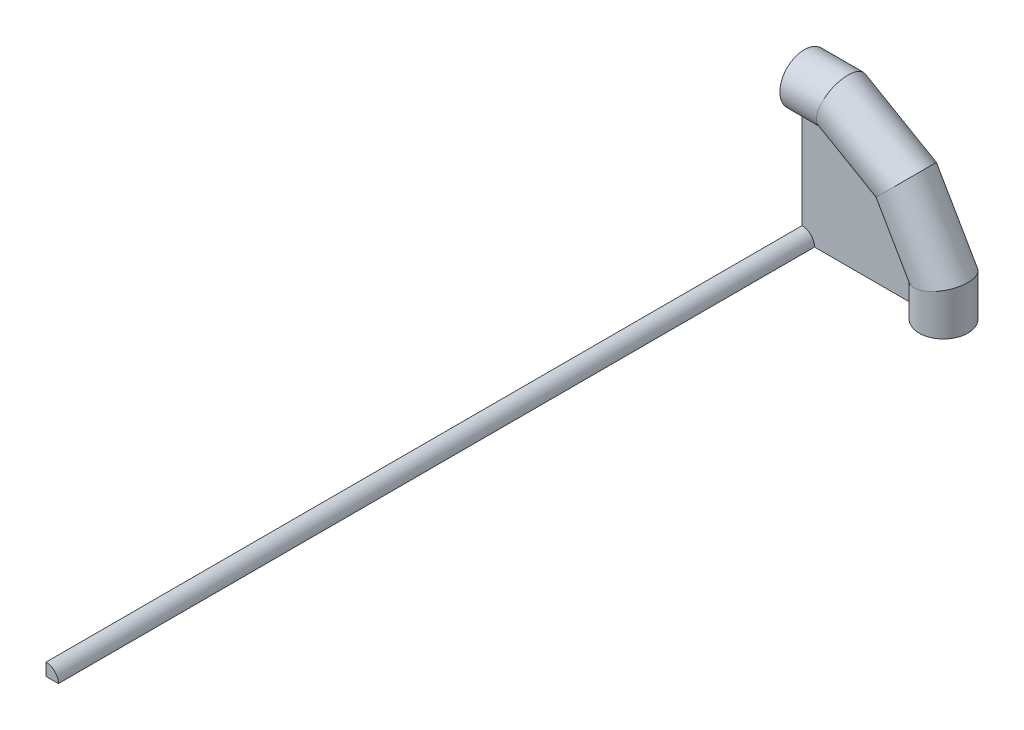
ISO-10303-21;
HEADER;
FILE_DESCRIPTION(('STEP AP214'),'2;1');
FILE_NAME('part.step','',(''),(''),'','','');
FILE_SCHEMA(('AUTOMOTIVE_DESIGN { 1 0 10303 214 1 1 1 1 }'));
ENDSEC;
DATA;
#1=APPLICATION_CONTEXT('core data for automotive mechanical design processes');
#2=APPLICATION_PROTOCOL_DEFINITION('international standard','automotive_design',2000,#1);
#3=PRODUCT_CONTEXT('',#1,'mechanical');
#4=PRODUCT('Part','Part','',(#3));
#5=PRODUCT_RELATED_PRODUCT_CATEGORY('part','',(#4));
#6=PRODUCT_DEFINITION_FORMATION('','',#4);
#7=PRODUCT_DEFINITION_CONTEXT('part definition',#1,'design');
#8=PRODUCT_DEFINITION('design','',#6,#7);
#9=PRODUCT_DEFINITION_SHAPE('','',#8);
#10=(LENGTH_UNIT() NAMED_UNIT(*) SI_UNIT(.MILLI.,.METRE.));
#11=(NAMED_UNIT(*) PLANE_ANGLE_UNIT() SI_UNIT($,.RADIAN.));
#12=(NAMED_UNIT(*) SI_UNIT($,.STERADIAN.) SOLID_ANGLE_UNIT());
#13=UNCERTAINTY_MEASURE_WITH_UNIT(LENGTH_MEASURE(1.E-05),#10,'distance_accuracy_value','');
#14=(GEOMETRIC_REPRESENTATION_CONTEXT(3) GLOBAL_UNCERTAINTY_ASSIGNED_CONTEXT((#13)) GLOBAL_UNIT_ASSIGNED_CONTEXT((#10,
#11,#12)) REPRESENTATION_CONTEXT('',''));
#15=CARTESIAN_POINT('',(0.,0.,0.));
#16=DIRECTION('',(0.,0.,1.));
#17=DIRECTION('',(1.,0.,0.));
#18=AXIS2_PLACEMENT_3D('',#15,#16,#17);
#19=CARTESIAN_POINT('',(0.,0.,27320.8457285967));
#20=DIRECTION('',(0.,0.,-1.));
#21=DIRECTION('',(-1.,0.,0.));
#22=AXIS2_PLACEMENT_3D('',#19,#20,#21);
#23=CYLINDRICAL_SURFACE('',#22,533.4);
#24=DIRECTION('',(0.,0.,-1.));
#25=VECTOR('',#24,1.);
#26=CARTESIAN_POINT('',(0.,533.4,27320.8457285967));
#27=LINE('',#26,#25);
#28=CARTESIAN_POINT('',(0.,533.4,22424.9957285967));
#29=VERTEX_POINT('',#28);
#30=CARTESIAN_POINT('',(0.,533.4,-10079.1542714033));
#31=VERTEX_POINT('',#30);
#32=EDGE_CURVE('E160',#29,#31,#27,.T.);
#33=ORIENTED_EDGE('',*,*,#32,.F.);
#34=CARTESIAN_POINT('',(0.,0.,22424.9957285967));
#35=DIRECTION('',(0.,0.,1.));
#36=DIRECTION('',(1.,0.,0.));
#37=AXIS2_PLACEMENT_3D('',#34,#35,#36);
#38=CIRCLE('',#37,533.4);
#39=CARTESIAN_POINT('',(533.4,0.,22424.9957285967));
#40=VERTEX_POINT('',#39);
#41=EDGE_CURVE('E110',#40,#29,#38,.T.);
#42=ORIENTED_EDGE('',*,*,#41,.F.);
#43=DIRECTION('',(0.,0.,-1.));
#44=VECTOR('',#43,1.);
#45=CARTESIAN_POINT('',(533.4,0.,27320.8457285967));
#46=LINE('',#45,#44);
#47=CARTESIAN_POINT('',(533.4,0.,-10079.1542714033));
#48=VERTEX_POINT('',#47);
#49=EDGE_CURVE('E114',#48,#40,#46,.F.);
#50=ORIENTED_EDGE('',*,*,#49,.F.);
#51=CARTESIAN_POINT('',(0.,0.,-10079.1542714033));
#52=DIRECTION('',(0.,0.,1.));
#53=DIRECTION('',(1.,0.,0.));
#54=AXIS2_PLACEMENT_3D('',#51,#52,#53);
#55=CIRCLE('',#54,533.4);
#56=EDGE_CURVE('E120',#48,#31,#55,.T.);
#57=ORIENTED_EDGE('',*,*,#56,.T.);
#58=EDGE_LOOP('',(#33,#42,#50,#57));
#59=FACE_BOUND('',#58,.T.);
#60=ADVANCED_FACE('F41',(#59),#23,.T.);
#61=CARTESIAN_POINT('',(5016.94381271306,5016.9577247322,-10079.1542714032));
#62=DIRECTION('',(0.,0.,-1.));
#63=DIRECTION('',(0.,-1.,0.));
#64=AXIS2_PLACEMENT_3D('',#61,#62,#63);
#65=PLANE('',#64);
#66=DIRECTION('',(0.,1.,0.));
#67=VECTOR('',#66,1.);
#68=CARTESIAN_POINT('',(0.,5016.9577247322,-10079.1542714032));
#69=LINE('',#68,#67);
#70=CARTESIAN_POINT('',(0.,4945.53834937897,-10079.1542714032));
#71=VERTEX_POINT('',#70);
#72=EDGE_CURVE('E156',#31,#71,#69,.T.);
#73=ORIENTED_EDGE('',*,*,#72,.F.);
#74=ORIENTED_EDGE('',*,*,#56,.F.);
#75=DIRECTION('',(-1.,0.,0.));
#76=VECTOR('',#75,1.);
#77=CARTESIAN_POINT('',(5016.94381271306,0.,-10079.1542714033));
#78=LINE('',#77,#76);
#79=CARTESIAN_POINT('',(4945.52443736012,0.,-10079.1542714033));
#80=VERTEX_POINT('',#79);
#81=EDGE_CURVE('E153',#80,#48,#78,.T.);
#82=ORIENTED_EDGE('',*,*,#81,.F.);
#83=DIRECTION('',(0.,1.,0.));
#84=VECTOR('',#83,1.);
#85=CARTESIAN_POINT('',(4945.52443736134,-70408.8045552679,-10079.154271404));
#86=LINE('',#85,#84);
#87=CARTESIAN_POINT('',(4945.52443736009,1325.14967216577,-10079.1542714033));
#88=VERTEX_POINT('',#87);
#89=EDGE_CURVE('E115',#88,#80,#86,.F.);
#90=ORIENTED_EDGE('',*,*,#89,.F.);
#91=DIRECTION('',(-0.500000000000016,0.866025403784429,0.));
#92=VECTOR('',#91,1.);
#93=CARTESIAN_POINT('',(39487.3473236444,-58503.0425529215,-10079.1542714041));
#94=LINE('',#93,#92);
#95=CARTESIAN_POINT('',(3620.37020992644,3620.38412194544,-10079.1542714032));
#96=VERTEX_POINT('',#95);
#97=EDGE_CURVE('E127',#96,#88,#94,.F.);
#98=ORIENTED_EDGE('',*,*,#97,.F.);
#99=DIRECTION('',(-0.866025403784449,0.499999999999983,0.));
#100=VECTOR('',#99,1.);
#101=CARTESIAN_POINT('',(63448.5624350151,-30921.4387643366,-10079.154271404));
#102=LINE('',#101,#100);
#103=CARTESIAN_POINT('',(1325.13576014672,4945.538349379,-10079.1542714032));
#104=VERTEX_POINT('',#103);
#105=EDGE_CURVE('E135',#104,#96,#102,.F.);
#106=ORIENTED_EDGE('',*,*,#105,.F.);
#107=DIRECTION('',(-1.,0.,0.));
#108=VECTOR('',#107,1.);
#109=CARTESIAN_POINT('',(70408.7815327131,4945.53834938045,-10079.1542714037));
#110=LINE('',#109,#108);
#111=EDGE_CURVE('E144',#71,#104,#110,.F.);
#112=ORIENTED_EDGE('',*,*,#111,.F.);
#113=EDGE_LOOP('',(#73,#74,#82,#90,#98,#106,#112));
#114=FACE_BOUND('',#113,.T.);
#115=ADVANCED_FACE('F43',(#114),#65,.F.);
#116=CARTESIAN_POINT('',(5016.94381271306,5016.9577247322,-10262.5105214032));
#117=DIRECTION('',(0.,0.,-1.));
#118=DIRECTION('',(0.,-1.,0.));
#119=AXIS2_PLACEMENT_3D('',#116,#117,#118);
#120=PLANE('',#119);
#121=DIRECTION('',(-1.,0.,0.));
#122=VECTOR('',#121,1.);
#123=CARTESIAN_POINT('',(5016.94381271306,0.,-10262.5105214033));
#124=LINE('',#123,#122);
#125=CARTESIAN_POINT('',(4945.52443736011,0.,-10262.5105214033));
#126=VERTEX_POINT('',#125);
#127=CARTESIAN_POINT('',(0.,0.,-10262.5105214033));
#128=VERTEX_POINT('',#127);
#129=EDGE_CURVE('E121',#126,#128,#124,.T.);
#130=ORIENTED_EDGE('',*,*,#129,.T.);
#131=DIRECTION('',(0.,1.,0.));
#132=VECTOR('',#131,1.);
#133=CARTESIAN_POINT('',(0.,5016.9577247322,-10262.5105214032));
#134=LINE('',#133,#132);
#135=CARTESIAN_POINT('',(0.,4945.538349379,-10262.5105214032));
#136=VERTEX_POINT('',#135);
#137=EDGE_CURVE('E56',#128,#136,#134,.T.);
#138=ORIENTED_EDGE('',*,*,#137,.T.);
#139=DIRECTION('',(-1.,0.,0.));
#140=VECTOR('',#139,1.);
#141=CARTESIAN_POINT('',(70408.7815327131,4945.53834938045,-10262.5105214037));
#142=LINE('',#141,#140);
#143=CARTESIAN_POINT('',(1325.13576014672,4945.538349379,-10262.5105214032));
#144=VERTEX_POINT('',#143);
#145=EDGE_CURVE('E146',#136,#144,#142,.F.);
#146=ORIENTED_EDGE('',*,*,#145,.T.);
#147=DIRECTION('',(-0.866025403784449,0.499999999999983,0.));
#148=VECTOR('',#147,1.);
#149=CARTESIAN_POINT('',(63448.5624350151,-30921.4387643366,-10262.510521404));
#150=LINE('',#149,#148);
#151=CARTESIAN_POINT('',(3620.37020992644,3620.38412194544,-10262.5105214032));
#152=VERTEX_POINT('',#151);
#153=EDGE_CURVE('E138',#144,#152,#150,.F.);
#154=ORIENTED_EDGE('',*,*,#153,.T.);
#155=DIRECTION('',(-0.500000000000016,0.866025403784429,0.));
#156=VECTOR('',#155,1.);
#157=CARTESIAN_POINT('',(39487.3473236444,-58503.0425529215,-10262.5105214042));
#158=LINE('',#157,#156);
#159=CARTESIAN_POINT('',(4945.52443736009,1325.14967216577,-10262.5105214033));
#160=VERTEX_POINT('',#159);
#161=EDGE_CURVE('E130',#152,#160,#158,.F.);
#162=ORIENTED_EDGE('',*,*,#161,.T.);
#163=DIRECTION('',(0.,1.,0.));
#164=VECTOR('',#163,1.);
#165=CARTESIAN_POINT('',(4945.52443736134,-70408.8045552679,-10262.510521404));
#166=LINE('',#165,#164);
#167=EDGE_CURVE('E117',#160,#126,#166,.F.);
#168=ORIENTED_EDGE('',*,*,#167,.T.);
#169=EDGE_LOOP('',(#130,#138,#146,#154,#162,#168));
#170=FACE_BOUND('',#169,.T.);
#171=ADVANCED_FACE('F164',(#170),#120,.T.);
#172=CARTESIAN_POINT('',(0.,0.,22424.9957285967));
#173=DIRECTION('',(0.,0.,1.));
#174=DIRECTION('',(1.,0.,0.));
#175=AXIS2_PLACEMENT_3D('',#172,#173,#174);
#176=PLANE('',#175);
#177=ORIENTED_EDGE('',*,*,#41,.T.);
#178=DIRECTION('',(0.,-1.,0.));
#179=VECTOR('',#178,1.);
#180=CARTESIAN_POINT('',(0.,0.,22424.9957285967));
#181=LINE('',#180,#179);
#182=CARTESIAN_POINT('',(0.,0.,22424.9957285967));
#183=VERTEX_POINT('',#182);
#184=EDGE_CURVE('E104',#29,#183,#181,.T.);
#185=ORIENTED_EDGE('',*,*,#184,.T.);
#186=DIRECTION('',(1.,0.,0.));
#187=VECTOR('',#186,1.);
#188=CARTESIAN_POINT('',(0.,0.,22424.9957285967));
#189=LINE('',#188,#187);
#190=EDGE_CURVE('E49',#183,#40,#189,.T.);
#191=ORIENTED_EDGE('',*,*,#190,.T.);
#192=EDGE_LOOP('',(#177,#185,#191));
#193=FACE_BOUND('',#192,.T.);
#194=ADVANCED_FACE('F108',(#193),#176,.T.);
#195=CARTESIAN_POINT('',(70408.7815327131,5989.26972473356,-10170.8323964037));
#196=DIRECTION('',(-1.,0.,0.));
#197=DIRECTION('',(0.,-1.,0.));
#198=AXIS2_PLACEMENT_3D('',#195,#196,#197);
#199=CYLINDRICAL_SURFACE('',#198,1047.75);
#200=CARTESIAN_POINT('',(0.,5989.26972473208,-10170.8323964032));
#201=DIRECTION('',(-1.,0.,0.));
#202=DIRECTION('',(0.,0.,1.));
#203=AXIS2_PLACEMENT_3D('',#200,#201,#202);
#204=CIRCLE('',#203,1047.75);
#205=EDGE_CURVE('E158',#71,#136,#204,.T.);
#206=ORIENTED_EDGE('',*,*,#205,.F.);
#207=ORIENTED_EDGE('',*,*,#111,.T.);
#208=CARTESIAN_POINT('',(1604.80273928758,5989.26972473212,-10170.8323964032));
#209=DIRECTION('',(-0.965925826289074,0.258819045102501,0.));
#210=DIRECTION('',(0.258819045102501,0.965925826289074,0.));
#211=AXIS2_PLACEMENT_3D('',#208,#209,#210);
#212=ELLIPSE('',#211,1084.71061802467,1047.75);
#213=EDGE_CURVE('E141',#104,#144,#212,.T.);
#214=ORIENTED_EDGE('',*,*,#213,.T.);
#215=ORIENTED_EDGE('',*,*,#145,.F.);
#216=EDGE_LOOP('',(#206,#207,#214,#215));
#217=FACE_BOUND('',#216,.T.);
#218=ADVANCED_FACE('F167',(#217),#199,.T.);
#219=CARTESIAN_POINT('',(0.,0.,0.));
#220=DIRECTION('',(0.,-1.,0.));
#221=DIRECTION('',(0.,0.,-1.));
#222=AXIS2_PLACEMENT_3D('',#219,#220,#221);
#223=PLANE('',#222);
#224=ORIENTED_EDGE('',*,*,#190,.F.);
#225=DIRECTION('',(0.,0.,-1.));
#226=VECTOR('',#225,1.);
#227=CARTESIAN_POINT('',(0.,0.,0.));
#228=LINE('',#227,#226);
#229=EDGE_CURVE('E12',#183,#128,#228,.T.);
#230=ORIENTED_EDGE('',*,*,#229,.T.);
#231=ORIENTED_EDGE('',*,*,#129,.F.);
#232=CARTESIAN_POINT('',(5989.25581271321,0.,-10170.8323964033));
#233=DIRECTION('',(0.,-1.,0.));
#234=DIRECTION('',(0.,0.,-1.));
#235=AXIS2_PLACEMENT_3D('',#232,#233,#234);
#236=CIRCLE('',#235,1047.75);
#237=EDGE_CURVE('E151',#126,#80,#236,.T.);
#238=ORIENTED_EDGE('',*,*,#237,.T.);
#239=ORIENTED_EDGE('',*,*,#81,.T.);
#240=ORIENTED_EDGE('',*,*,#49,.T.);
#241=EDGE_LOOP('',(#224,#230,#231,#238,#239,#240));
#242=FACE_BOUND('',#241,.T.);
#243=ADVANCED_FACE('F112',(#242),#223,.T.);
#244=CARTESIAN_POINT('',(5989.25581271444,-70408.8045552678,-10170.832396404));
#245=DIRECTION('',(0.,1.,0.));
#246=DIRECTION('',(-1.,0.,0.));
#247=AXIS2_PLACEMENT_3D('',#244,#245,#246);
#248=CYLINDRICAL_SURFACE('',#247,1047.75);
#249=ORIENTED_EDGE('',*,*,#237,.F.);
#250=ORIENTED_EDGE('',*,*,#167,.F.);
#251=CARTESIAN_POINT('',(5989.25581271319,1604.81665130669,-10170.8323964033));
#252=DIRECTION('',(-0.258819045102538,0.965925826289063,0.));
#253=DIRECTION('',(0.965925826289064,0.258819045102538,0.));
#254=AXIS2_PLACEMENT_3D('',#251,#252,#253);
#255=ELLIPSE('',#254,1084.71061802467,1047.75);
#256=EDGE_CURVE('E125',#88,#160,#255,.T.);
#257=ORIENTED_EDGE('',*,*,#256,.F.);
#258=ORIENTED_EDGE('',*,*,#89,.T.);
#259=EDGE_LOOP('',(#249,#250,#257,#258));
#260=FACE_BOUND('',#259,.T.);
#261=ADVANCED_FACE('F182',(#260),#248,.T.);
#262=CARTESIAN_POINT('',(40391.2452094271,-57981.176865245,-10170.8323964042));
#263=DIRECTION('',(-0.500000000000016,0.866025403784429,0.));
#264=DIRECTION('',(-0.866025403784429,-0.500000000000016,0.));
#265=AXIS2_PLACEMENT_3D('',#262,#263,#264);
#266=CYLINDRICAL_SURFACE('',#265,1047.75);
#267=CARTESIAN_POINT('',(4384.43460613864,4384.44851815768,-10170.8323964032));
#268=DIRECTION('',(-0.707106781186561,0.707106781186534,0.));
#269=DIRECTION('',(0.707106781186534,0.707106781186561,0.));
#270=AXIS2_PLACEMENT_3D('',#267,#268,#269);
#271=ELLIPSE('',#270,1084.71061802467,1047.75);
#272=EDGE_CURVE('E133',#96,#152,#271,.T.);
#273=ORIENTED_EDGE('',*,*,#272,.F.);
#274=ORIENTED_EDGE('',*,*,#97,.T.);
#275=ORIENTED_EDGE('',*,*,#256,.T.);
#276=ORIENTED_EDGE('',*,*,#161,.F.);
#277=EDGE_LOOP('',(#273,#274,#275,#276));
#278=FACE_BOUND('',#277,.T.);
#279=ADVANCED_FACE('F178',(#278),#266,.T.);
#280=CARTESIAN_POINT('',(63970.4281226916,-30017.5408785539,-10170.832396404));
#281=DIRECTION('',(-0.866025403784449,0.499999999999983,0.));
#282=DIRECTION('',(-0.499999999999983,-0.866025403784449,0.));
#283=AXIS2_PLACEMENT_3D('',#280,#281,#282);
#284=CYLINDRICAL_SURFACE('',#283,1047.75);
#285=ORIENTED_EDGE('',*,*,#213,.F.);
#286=ORIENTED_EDGE('',*,*,#105,.T.);
#287=ORIENTED_EDGE('',*,*,#272,.T.);
#288=ORIENTED_EDGE('',*,*,#153,.F.);
#289=EDGE_LOOP('',(#285,#286,#287,#288));
#290=FACE_BOUND('',#289,.T.);
#291=ADVANCED_FACE('F173',(#290),#284,.T.);
#292=CARTESIAN_POINT('',(0.,0.,0.));
#293=DIRECTION('',(-1.,0.,0.));
#294=DIRECTION('',(0.,0.,1.));
#295=AXIS2_PLACEMENT_3D('',#292,#293,#294);
#296=PLANE('',#295);
#297=ORIENTED_EDGE('',*,*,#72,.T.);
#298=ORIENTED_EDGE('',*,*,#205,.T.);
#299=ORIENTED_EDGE('',*,*,#137,.F.);
#300=ORIENTED_EDGE('',*,*,#229,.F.);
#301=ORIENTED_EDGE('',*,*,#184,.F.);
#302=ORIENTED_EDGE('',*,*,#32,.T.);
#303=EDGE_LOOP('',(#297,#298,#299,#300,#301,#302));
#304=FACE_BOUND('',#303,.T.);
#305=ADVANCED_FACE('F103',(#304),#296,.T.);
#306=CLOSED_SHELL('',(#60,#115,#171,#194,#218,#243,#261,#279,#291,#305));
#307=MANIFOLD_SOLID_BREP('B2',#306);
#308=ADVANCED_BREP_SHAPE_REPRESENTATION('',(#18,#307),#14);
#309=SHAPE_DEFINITION_REPRESENTATION(#9,#308);
ENDSEC;
END-ISO-10303-21;
